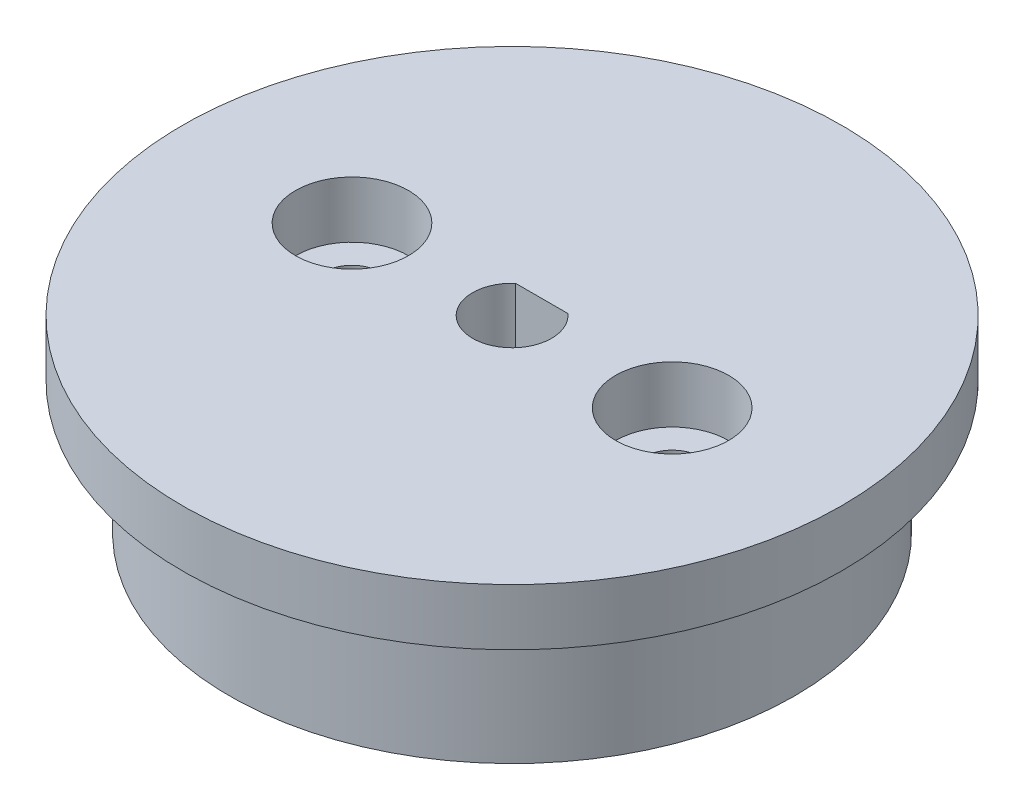
ISO-10303-21;
HEADER;
FILE_DESCRIPTION(('STEP AP214'),'2;1');
FILE_NAME('part.step','',(''),(''),'','','');
FILE_SCHEMA(('AUTOMOTIVE_DESIGN { 1 0 10303 214 1 1 1 1 }'));
ENDSEC;
DATA;
#1=APPLICATION_CONTEXT('core data for automotive mechanical design processes');
#2=APPLICATION_PROTOCOL_DEFINITION('international standard','automotive_design',2000,#1);
#3=PRODUCT_CONTEXT('',#1,'mechanical');
#4=PRODUCT('Part','Part','',(#3));
#5=PRODUCT_RELATED_PRODUCT_CATEGORY('part','',(#4));
#6=PRODUCT_DEFINITION_FORMATION('','',#4);
#7=PRODUCT_DEFINITION_CONTEXT('part definition',#1,'design');
#8=PRODUCT_DEFINITION('design','',#6,#7);
#9=PRODUCT_DEFINITION_SHAPE('','',#8);
#10=(LENGTH_UNIT() NAMED_UNIT(*) SI_UNIT(.MILLI.,.METRE.));
#11=(NAMED_UNIT(*) PLANE_ANGLE_UNIT() SI_UNIT($,.RADIAN.));
#12=(NAMED_UNIT(*) SI_UNIT($,.STERADIAN.) SOLID_ANGLE_UNIT());
#13=UNCERTAINTY_MEASURE_WITH_UNIT(LENGTH_MEASURE(1.E-05),#10,'distance_accuracy_value','');
#14=(GEOMETRIC_REPRESENTATION_CONTEXT(3) GLOBAL_UNCERTAINTY_ASSIGNED_CONTEXT((#13)) GLOBAL_UNIT_ASSIGNED_CONTEXT((#10,
#11,#12)) REPRESENTATION_CONTEXT('',''));
#15=CARTESIAN_POINT('',(0.,0.,0.));
#16=DIRECTION('',(0.,0.,1.));
#17=DIRECTION('',(1.,0.,0.));
#18=AXIS2_PLACEMENT_3D('',#15,#16,#17);
#19=CARTESIAN_POINT('',(6.5,10.,0.));
#20=DIRECTION('',(0.,-1.,0.));
#21=DIRECTION('',(1.,0.,0.));
#22=AXIS2_PLACEMENT_3D('',#19,#20,#21);
#23=CYLINDRICAL_SURFACE('',#22,1.5);
#24=CARTESIAN_POINT('',(6.5,0.,0.));
#25=DIRECTION('',(0.,-1.,0.));
#26=DIRECTION('',(1.,0.,0.));
#27=AXIS2_PLACEMENT_3D('',#24,#25,#26);
#28=CIRCLE('',#27,1.5);
#29=CARTESIAN_POINT('',(8.,0.,0.));
#30=VERTEX_POINT('',#29);
#31=EDGE_CURVE('E79',#30,#30,#28,.T.);
#32=ORIENTED_EDGE('',*,*,#31,.T.);
#33=EDGE_LOOP('',(#32));
#34=FACE_BOUND('',#33,.T.);
#35=CARTESIAN_POINT('',(6.5,7.00000000000001,0.));
#36=DIRECTION('',(0.,1.,0.));
#37=DIRECTION('',(-1.,0.,0.));
#38=AXIS2_PLACEMENT_3D('',#35,#36,#37);
#39=CIRCLE('',#38,1.5);
#40=CARTESIAN_POINT('',(5.,7.00000000000001,0.));
#41=VERTEX_POINT('',#40);
#42=EDGE_CURVE('E37',#41,#41,#39,.F.);
#43=ORIENTED_EDGE('',*,*,#42,.F.);
#44=EDGE_LOOP('',(#43));
#45=FACE_BOUND('',#44,.T.);
#46=ADVANCED_FACE('F33',(#34,#45),#23,.F.);
#47=CARTESIAN_POINT('',(23.5,10.,0.));
#48=DIRECTION('',(0.,-1.,0.));
#49=DIRECTION('',(1.,0.,0.));
#50=AXIS2_PLACEMENT_3D('',#47,#48,#49);
#51=CYLINDRICAL_SURFACE('',#50,1.5);
#52=CARTESIAN_POINT('',(23.5,0.,0.));
#53=DIRECTION('',(0.,-1.,0.));
#54=DIRECTION('',(1.,0.,0.));
#55=AXIS2_PLACEMENT_3D('',#52,#53,#54);
#56=CIRCLE('',#55,1.5);
#57=CARTESIAN_POINT('',(25.,0.,0.));
#58=VERTEX_POINT('',#57);
#59=EDGE_CURVE('E86',#58,#58,#56,.T.);
#60=ORIENTED_EDGE('',*,*,#59,.T.);
#61=EDGE_LOOP('',(#60));
#62=FACE_BOUND('',#61,.T.);
#63=CARTESIAN_POINT('',(23.5,7.,0.));
#64=DIRECTION('',(0.,1.,0.));
#65=DIRECTION('',(-1.,0.,0.));
#66=AXIS2_PLACEMENT_3D('',#63,#64,#65);
#67=CIRCLE('',#66,1.5);
#68=CARTESIAN_POINT('',(22.,7.,0.));
#69=VERTEX_POINT('',#68);
#70=EDGE_CURVE('E90',#69,#69,#67,.F.);
#71=ORIENTED_EDGE('',*,*,#70,.F.);
#72=EDGE_LOOP('',(#71));
#73=FACE_BOUND('',#72,.T.);
#74=ADVANCED_FACE('F115',(#62,#73),#51,.F.);
#75=CARTESIAN_POINT('',(0.,0.,0.));
#76=DIRECTION('',(0.,1.,0.));
#77=DIRECTION('',(-1.,0.,0.));
#78=AXIS2_PLACEMENT_3D('',#75,#76,#77);
#79=PLANE('',#78);
#80=ORIENTED_EDGE('',*,*,#59,.F.);
#81=EDGE_LOOP('',(#80));
#82=FACE_BOUND('',#81,.T.);
#83=CARTESIAN_POINT('',(15.,0.,0.));
#84=DIRECTION('',(0.,-1.,0.));
#85=DIRECTION('',(1.,0.,0.));
#86=AXIS2_PLACEMENT_3D('',#83,#84,#85);
#87=CIRCLE('',#86,15.);
#88=CARTESIAN_POINT('',(30.,0.,0.));
#89=VERTEX_POINT('',#88);
#90=EDGE_CURVE('E11',#89,#89,#87,.T.);
#91=ORIENTED_EDGE('',*,*,#90,.T.);
#92=EDGE_LOOP('',(#91));
#93=FACE_BOUND('',#92,.T.);
#94=ORIENTED_EDGE('',*,*,#31,.F.);
#95=EDGE_LOOP('',(#94));
#96=FACE_BOUND('',#95,.T.);
#97=CARTESIAN_POINT('',(15.,0.,0.));
#98=DIRECTION('',(0.,1.,0.));
#99=DIRECTION('',(-1.,0.,0.));
#100=AXIS2_PLACEMENT_3D('',#97,#98,#99);
#101=CIRCLE('',#100,2.1);
#102=CARTESIAN_POINT('',(13.61,0.,-1.57413468292901));
#103=VERTEX_POINT('',#102);
#104=CARTESIAN_POINT('',(16.39,0.,-1.57413468292901));
#105=VERTEX_POINT('',#104);
#106=EDGE_CURVE('E50',#103,#105,#101,.T.);
#107=ORIENTED_EDGE('',*,*,#106,.T.);
#108=DIRECTION('',(-1.,0.,0.));
#109=VECTOR('',#108,1.);
#110=CARTESIAN_POINT('',(16.39,0.,-1.57413468292901));
#111=LINE('',#110,#109);
#112=EDGE_CURVE('E74',#105,#103,#111,.T.);
#113=ORIENTED_EDGE('',*,*,#112,.T.);
#114=EDGE_LOOP('',(#107,#113));
#115=FACE_BOUND('',#114,.T.);
#116=ADVANCED_FACE('F113',(#82,#93,#96,#115),#79,.F.);
#117=CARTESIAN_POINT('',(-2.5,10.,0.));
#118=DIRECTION('',(0.,-1.,0.));
#119=DIRECTION('',(1.,0.,0.));
#120=AXIS2_PLACEMENT_3D('',#117,#118,#119);
#121=PLANE('',#120);
#122=CARTESIAN_POINT('',(6.5,10.,0.));
#123=DIRECTION('',(0.,1.,0.));
#124=DIRECTION('',(-1.,0.,0.));
#125=AXIS2_PLACEMENT_3D('',#122,#123,#124);
#126=CIRCLE('',#125,3.);
#127=CARTESIAN_POINT('',(3.5,10.,0.));
#128=VERTEX_POINT('',#127);
#129=EDGE_CURVE('E97',#128,#128,#126,.T.);
#130=ORIENTED_EDGE('',*,*,#129,.F.);
#131=EDGE_LOOP('',(#130));
#132=FACE_BOUND('',#131,.T.);
#133=CARTESIAN_POINT('',(23.5,10.,0.));
#134=DIRECTION('',(0.,1.,0.));
#135=DIRECTION('',(-1.,0.,0.));
#136=AXIS2_PLACEMENT_3D('',#133,#134,#135);
#137=CIRCLE('',#136,3.);
#138=CARTESIAN_POINT('',(20.5,10.,0.));
#139=VERTEX_POINT('',#138);
#140=EDGE_CURVE('E107',#139,#139,#137,.T.);
#141=ORIENTED_EDGE('',*,*,#140,.F.);
#142=EDGE_LOOP('',(#141));
#143=FACE_BOUND('',#142,.T.);
#144=CARTESIAN_POINT('',(15.,10.,0.));
#145=DIRECTION('',(0.,-1.,0.));
#146=DIRECTION('',(1.,0.,0.));
#147=AXIS2_PLACEMENT_3D('',#144,#145,#146);
#148=CIRCLE('',#147,17.5);
#149=CARTESIAN_POINT('',(32.5,10.,0.));
#150=VERTEX_POINT('',#149);
#151=EDGE_CURVE('E42',#150,#150,#148,.T.);
#152=ORIENTED_EDGE('',*,*,#151,.F.);
#153=EDGE_LOOP('',(#152));
#154=FACE_BOUND('',#153,.T.);
#155=CARTESIAN_POINT('',(15.,10.,0.));
#156=DIRECTION('',(0.,1.,0.));
#157=DIRECTION('',(-1.,0.,0.));
#158=AXIS2_PLACEMENT_3D('',#155,#156,#157);
#159=CIRCLE('',#158,2.1);
#160=CARTESIAN_POINT('',(13.61,10.,-1.57413468292901));
#161=VERTEX_POINT('',#160);
#162=CARTESIAN_POINT('',(16.39,10.,-1.57413468292901));
#163=VERTEX_POINT('',#162);
#164=EDGE_CURVE('E69',#161,#163,#159,.T.);
#165=ORIENTED_EDGE('',*,*,#164,.F.);
#166=DIRECTION('',(-1.,0.,0.));
#167=VECTOR('',#166,1.);
#168=CARTESIAN_POINT('',(16.39,10.,-1.57413468292901));
#169=LINE('',#168,#167);
#170=EDGE_CURVE('E63',#163,#161,#169,.T.);
#171=ORIENTED_EDGE('',*,*,#170,.F.);
#172=EDGE_LOOP('',(#165,#171));
#173=FACE_BOUND('',#172,.T.);
#174=ADVANCED_FACE('F73',(#132,#143,#154,#173),#121,.F.);
#175=CARTESIAN_POINT('',(15.,0.,0.));
#176=DIRECTION('',(0.,-1.,0.));
#177=DIRECTION('',(1.,0.,0.));
#178=AXIS2_PLACEMENT_3D('',#175,#176,#177);
#179=CYLINDRICAL_SURFACE('',#178,15.);
#180=ORIENTED_EDGE('',*,*,#90,.F.);
#181=EDGE_LOOP('',(#180));
#182=FACE_BOUND('',#181,.T.);
#183=CARTESIAN_POINT('',(15.,7.,0.));
#184=DIRECTION('',(0.,-1.,0.));
#185=DIRECTION('',(1.,0.,0.));
#186=AXIS2_PLACEMENT_3D('',#183,#184,#185);
#187=CIRCLE('',#186,15.);
#188=CARTESIAN_POINT('',(30.,7.,0.));
#189=VERTEX_POINT('',#188);
#190=EDGE_CURVE('E82',#189,#189,#187,.T.);
#191=ORIENTED_EDGE('',*,*,#190,.T.);
#192=EDGE_LOOP('',(#191));
#193=FACE_BOUND('',#192,.T.);
#194=ADVANCED_FACE('F35',(#182,#193),#179,.T.);
#195=CARTESIAN_POINT('',(15.,0.,0.));
#196=DIRECTION('',(0.,-1.,0.));
#197=DIRECTION('',(1.,0.,0.));
#198=AXIS2_PLACEMENT_3D('',#195,#196,#197);
#199=CYLINDRICAL_SURFACE('',#198,17.5);
#200=CARTESIAN_POINT('',(15.,7.,0.));
#201=DIRECTION('',(0.,-1.,0.));
#202=DIRECTION('',(1.,0.,0.));
#203=AXIS2_PLACEMENT_3D('',#200,#201,#202);
#204=CIRCLE('',#203,17.5);
#205=CARTESIAN_POINT('',(32.5,7.,0.));
#206=VERTEX_POINT('',#205);
#207=EDGE_CURVE('E85',#206,#206,#204,.T.);
#208=ORIENTED_EDGE('',*,*,#207,.F.);
#209=EDGE_LOOP('',(#208));
#210=FACE_BOUND('',#209,.T.);
#211=ORIENTED_EDGE('',*,*,#151,.T.);
#212=EDGE_LOOP('',(#211));
#213=FACE_BOUND('',#212,.T.);
#214=ADVANCED_FACE('F139',(#210,#213),#199,.T.);
#215=CARTESIAN_POINT('',(0.,7.00000000000001,0.));
#216=DIRECTION('',(0.,1.,0.));
#217=DIRECTION('',(-1.,0.,0.));
#218=AXIS2_PLACEMENT_3D('',#215,#216,#217);
#219=PLANE('',#218);
#220=ORIENTED_EDGE('',*,*,#190,.F.);
#221=EDGE_LOOP('',(#220));
#222=FACE_BOUND('',#221,.T.);
#223=ORIENTED_EDGE('',*,*,#207,.T.);
#224=EDGE_LOOP('',(#223));
#225=FACE_BOUND('',#224,.T.);
#226=ADVANCED_FACE('F136',(#222,#225),#219,.F.);
#227=CARTESIAN_POINT('',(15.,10.,0.));
#228=DIRECTION('',(0.,-1.,0.));
#229=DIRECTION('',(1.,0.,0.));
#230=AXIS2_PLACEMENT_3D('',#227,#228,#229);
#231=CYLINDRICAL_SURFACE('',#230,2.1);
#232=ORIENTED_EDGE('',*,*,#106,.F.);
#233=DIRECTION('',(0.,-1.,0.));
#234=VECTOR('',#233,1.);
#235=CARTESIAN_POINT('',(13.61,10.,-1.57413468292901));
#236=LINE('',#235,#234);
#237=EDGE_CURVE('E65',#161,#103,#236,.T.);
#238=ORIENTED_EDGE('',*,*,#237,.F.);
#239=ORIENTED_EDGE('',*,*,#164,.T.);
#240=DIRECTION('',(0.,-1.,0.));
#241=VECTOR('',#240,1.);
#242=CARTESIAN_POINT('',(16.39,10.,-1.57413468292901));
#243=LINE('',#242,#241);
#244=EDGE_CURVE('E57',#163,#105,#243,.T.);
#245=ORIENTED_EDGE('',*,*,#244,.T.);
#246=EDGE_LOOP('',(#232,#238,#239,#245));
#247=FACE_BOUND('',#246,.T.);
#248=ADVANCED_FACE('F71',(#247),#231,.F.);
#249=CARTESIAN_POINT('',(16.39,10.,-1.57413468292901));
#250=DIRECTION('',(0.,0.,1.));
#251=DIRECTION('',(1.,0.,0.));
#252=AXIS2_PLACEMENT_3D('',#249,#250,#251);
#253=PLANE('',#252);
#254=ORIENTED_EDGE('',*,*,#112,.F.);
#255=ORIENTED_EDGE('',*,*,#244,.F.);
#256=ORIENTED_EDGE('',*,*,#170,.T.);
#257=ORIENTED_EDGE('',*,*,#237,.T.);
#258=EDGE_LOOP('',(#254,#255,#256,#257));
#259=FACE_BOUND('',#258,.T.);
#260=ADVANCED_FACE('F64',(#259),#253,.T.);
#261=CARTESIAN_POINT('',(23.5,7.,0.));
#262=DIRECTION('',(0.,1.,0.));
#263=DIRECTION('',(-1.,0.,0.));
#264=AXIS2_PLACEMENT_3D('',#261,#262,#263);
#265=PLANE('',#264);
#266=CARTESIAN_POINT('',(23.5,7.,0.));
#267=DIRECTION('',(0.,1.,0.));
#268=DIRECTION('',(-1.,0.,0.));
#269=AXIS2_PLACEMENT_3D('',#266,#267,#268);
#270=CIRCLE('',#269,3.);
#271=CARTESIAN_POINT('',(20.5,7.,0.));
#272=VERTEX_POINT('',#271);
#273=EDGE_CURVE('E102',#272,#272,#270,.T.);
#274=ORIENTED_EDGE('',*,*,#273,.T.);
#275=EDGE_LOOP('',(#274));
#276=FACE_BOUND('',#275,.T.);
#277=ORIENTED_EDGE('',*,*,#70,.T.);
#278=EDGE_LOOP('',(#277));
#279=FACE_BOUND('',#278,.T.);
#280=ADVANCED_FACE('F173',(#276,#279),#265,.T.);
#281=CARTESIAN_POINT('',(23.5,7.,0.));
#282=DIRECTION('',(0.,1.,0.));
#283=DIRECTION('',(-1.,0.,0.));
#284=AXIS2_PLACEMENT_3D('',#281,#282,#283);
#285=CYLINDRICAL_SURFACE('',#284,3.);
#286=ORIENTED_EDGE('',*,*,#273,.F.);
#287=EDGE_LOOP('',(#286));
#288=FACE_BOUND('',#287,.T.);
#289=ORIENTED_EDGE('',*,*,#140,.T.);
#290=EDGE_LOOP('',(#289));
#291=FACE_BOUND('',#290,.T.);
#292=ADVANCED_FACE('F178',(#288,#291),#285,.F.);
#293=CARTESIAN_POINT('',(6.5,7.00000000000001,0.));
#294=DIRECTION('',(0.,1.,0.));
#295=DIRECTION('',(-1.,0.,0.));
#296=AXIS2_PLACEMENT_3D('',#293,#294,#295);
#297=PLANE('',#296);
#298=CARTESIAN_POINT('',(6.5,7.00000000000001,0.));
#299=DIRECTION('',(0.,1.,0.));
#300=DIRECTION('',(-1.,0.,0.));
#301=AXIS2_PLACEMENT_3D('',#298,#299,#300);
#302=CIRCLE('',#301,3.);
#303=CARTESIAN_POINT('',(3.5,7.00000000000001,0.));
#304=VERTEX_POINT('',#303);
#305=EDGE_CURVE('E92',#304,#304,#302,.T.);
#306=ORIENTED_EDGE('',*,*,#305,.T.);
#307=EDGE_LOOP('',(#306));
#308=FACE_BOUND('',#307,.T.);
#309=ORIENTED_EDGE('',*,*,#42,.T.);
#310=EDGE_LOOP('',(#309));
#311=FACE_BOUND('',#310,.T.);
#312=ADVANCED_FACE('F190',(#308,#311),#297,.T.);
#313=CARTESIAN_POINT('',(6.5,7.00000000000001,0.));
#314=DIRECTION('',(0.,1.,0.));
#315=DIRECTION('',(-1.,0.,0.));
#316=AXIS2_PLACEMENT_3D('',#313,#314,#315);
#317=CYLINDRICAL_SURFACE('',#316,3.);
#318=ORIENTED_EDGE('',*,*,#305,.F.);
#319=EDGE_LOOP('',(#318));
#320=FACE_BOUND('',#319,.T.);
#321=ORIENTED_EDGE('',*,*,#129,.T.);
#322=EDGE_LOOP('',(#321));
#323=FACE_BOUND('',#322,.T.);
#324=ADVANCED_FACE('F200',(#320,#323),#317,.F.);
#325=CLOSED_SHELL('',(#46,#74,#116,#174,#194,#214,#226,#248,#260,#280,#292,#312,#324));
#326=MANIFOLD_SOLID_BREP('B2',#325);
#327=ADVANCED_BREP_SHAPE_REPRESENTATION('',(#18,#326),#14);
#328=SHAPE_DEFINITION_REPRESENTATION(#9,#327);
ENDSEC;
END-ISO-10303-21;
